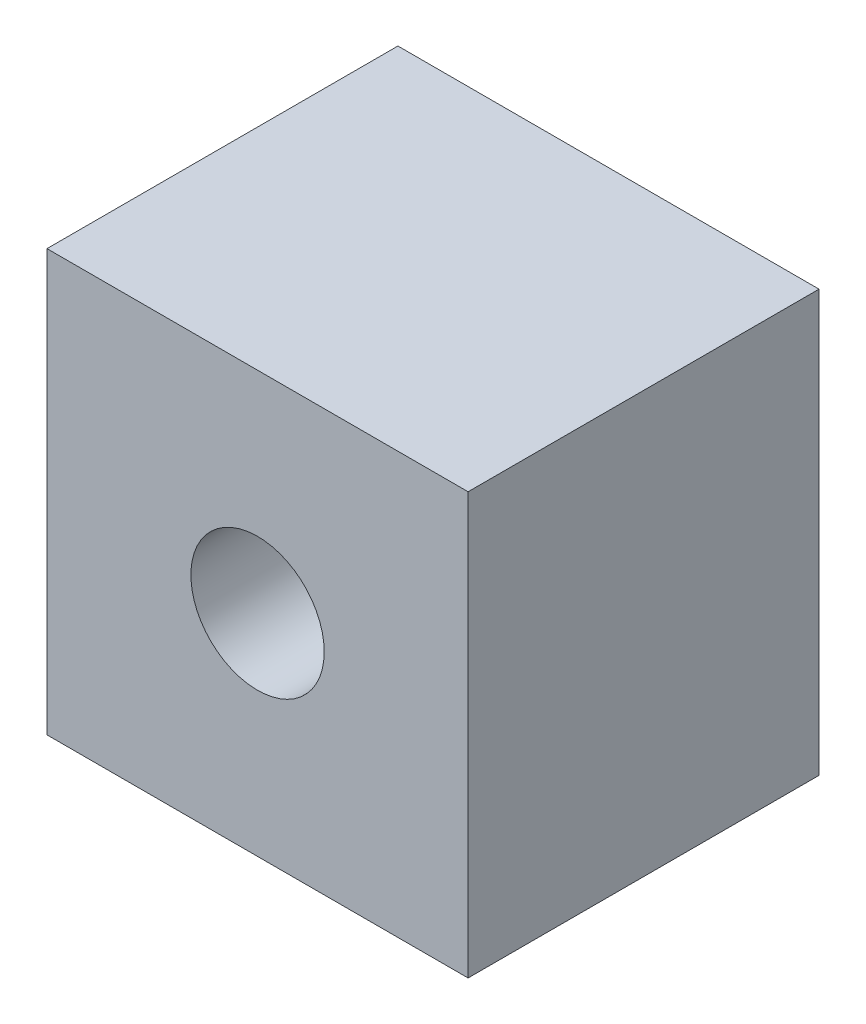
ISO-10303-21;
HEADER;
FILE_DESCRIPTION(('STEP AP214'),'2;1');
FILE_NAME('part.step','',(''),(''),'','','');
FILE_SCHEMA(('AUTOMOTIVE_DESIGN { 1 0 10303 214 1 1 1 1 }'));
ENDSEC;
DATA;
#1=APPLICATION_CONTEXT('core data for automotive mechanical design processes');
#2=APPLICATION_PROTOCOL_DEFINITION('international standard','automotive_design',2000,#1);
#3=PRODUCT_CONTEXT('',#1,'mechanical');
#4=PRODUCT('Part','Part','',(#3));
#5=PRODUCT_RELATED_PRODUCT_CATEGORY('part','',(#4));
#6=PRODUCT_DEFINITION_FORMATION('','',#4);
#7=PRODUCT_DEFINITION_CONTEXT('part definition',#1,'design');
#8=PRODUCT_DEFINITION('design','',#6,#7);
#9=PRODUCT_DEFINITION_SHAPE('','',#8);
#10=(LENGTH_UNIT() NAMED_UNIT(*) SI_UNIT(.MILLI.,.METRE.));
#11=(NAMED_UNIT(*) PLANE_ANGLE_UNIT() SI_UNIT($,.RADIAN.));
#12=(NAMED_UNIT(*) SI_UNIT($,.STERADIAN.) SOLID_ANGLE_UNIT());
#13=UNCERTAINTY_MEASURE_WITH_UNIT(LENGTH_MEASURE(1.E-05),#10,'distance_accuracy_value','');
#14=(GEOMETRIC_REPRESENTATION_CONTEXT(3) GLOBAL_UNCERTAINTY_ASSIGNED_CONTEXT((#13)) GLOBAL_UNIT_ASSIGNED_CONTEXT((#10,
#11,#12)) REPRESENTATION_CONTEXT('',''));
#15=CARTESIAN_POINT('',(0.,0.,0.));
#16=DIRECTION('',(0.,0.,1.));
#17=DIRECTION('',(1.,0.,0.));
#18=AXIS2_PLACEMENT_3D('',#15,#16,#17);
#19=CARTESIAN_POINT('',(0.,0.,10.));
#20=DIRECTION('',(0.,0.,1.));
#21=DIRECTION('',(1.,0.,0.));
#22=AXIS2_PLACEMENT_3D('',#19,#20,#21);
#23=PLANE('',#22);
#24=DIRECTION('',(0.,1.,0.));
#25=VECTOR('',#24,1.);
#26=CARTESIAN_POINT('',(6.,6.,10.));
#27=LINE('',#26,#25);
#28=CARTESIAN_POINT('',(6.,-6.,10.));
#29=VERTEX_POINT('',#28);
#30=CARTESIAN_POINT('',(6.,6.,10.));
#31=VERTEX_POINT('',#30);
#32=EDGE_CURVE('E92',#29,#31,#27,.T.);
#33=ORIENTED_EDGE('',*,*,#32,.T.);
#34=DIRECTION('',(-1.,0.,0.));
#35=VECTOR('',#34,1.);
#36=CARTESIAN_POINT('',(-6.,6.,10.));
#37=LINE('',#36,#35);
#38=CARTESIAN_POINT('',(-6.,6.,10.));
#39=VERTEX_POINT('',#38);
#40=EDGE_CURVE('E87',#31,#39,#37,.T.);
#41=ORIENTED_EDGE('',*,*,#40,.T.);
#42=DIRECTION('',(0.,-1.,0.));
#43=VECTOR('',#42,1.);
#44=CARTESIAN_POINT('',(-6.,6.,10.));
#45=LINE('',#44,#43);
#46=CARTESIAN_POINT('',(-6.,-6.,10.));
#47=VERTEX_POINT('',#46);
#48=EDGE_CURVE('E90',#39,#47,#45,.T.);
#49=ORIENTED_EDGE('',*,*,#48,.T.);
#50=DIRECTION('',(1.,0.,0.));
#51=VECTOR('',#50,1.);
#52=CARTESIAN_POINT('',(-6.,-6.,10.));
#53=LINE('',#52,#51);
#54=EDGE_CURVE('E57',#47,#29,#53,.T.);
#55=ORIENTED_EDGE('',*,*,#54,.T.);
#56=EDGE_LOOP('',(#33,#41,#49,#55));
#57=FACE_BOUND('',#56,.T.);
#58=CARTESIAN_POINT('',(0.,0.,10.));
#59=DIRECTION('',(0.,0.,1.));
#60=DIRECTION('',(1.,0.,0.));
#61=AXIS2_PLACEMENT_3D('',#58,#59,#60);
#62=CIRCLE('',#61,1.9);
#63=CARTESIAN_POINT('',(1.9,0.,10.));
#64=VERTEX_POINT('',#63);
#65=EDGE_CURVE('E112',#64,#64,#62,.T.);
#66=ORIENTED_EDGE('',*,*,#65,.F.);
#67=EDGE_LOOP('',(#66));
#68=FACE_BOUND('',#67,.T.);
#69=ADVANCED_FACE('F39',(#57,#68),#23,.T.);
#70=CARTESIAN_POINT('',(0.,0.,0.));
#71=DIRECTION('',(0.,0.,1.));
#72=DIRECTION('',(1.,0.,0.));
#73=AXIS2_PLACEMENT_3D('',#70,#71,#72);
#74=PLANE('',#73);
#75=DIRECTION('',(0.,1.,0.));
#76=VECTOR('',#75,1.);
#77=CARTESIAN_POINT('',(6.,6.,0.));
#78=LINE('',#77,#76);
#79=CARTESIAN_POINT('',(6.,-6.,0.));
#80=VERTEX_POINT('',#79);
#81=CARTESIAN_POINT('',(6.,6.,0.));
#82=VERTEX_POINT('',#81);
#83=EDGE_CURVE('E108',#80,#82,#78,.T.);
#84=ORIENTED_EDGE('',*,*,#83,.F.);
#85=DIRECTION('',(1.,0.,0.));
#86=VECTOR('',#85,1.);
#87=CARTESIAN_POINT('',(-6.,-6.,0.));
#88=LINE('',#87,#86);
#89=CARTESIAN_POINT('',(-6.,-6.,0.));
#90=VERTEX_POINT('',#89);
#91=EDGE_CURVE('E80',#90,#80,#88,.T.);
#92=ORIENTED_EDGE('',*,*,#91,.F.);
#93=DIRECTION('',(0.,-1.,0.));
#94=VECTOR('',#93,1.);
#95=CARTESIAN_POINT('',(-6.,6.,0.));
#96=LINE('',#95,#94);
#97=CARTESIAN_POINT('',(-6.,6.,0.));
#98=VERTEX_POINT('',#97);
#99=EDGE_CURVE('E74',#98,#90,#96,.T.);
#100=ORIENTED_EDGE('',*,*,#99,.F.);
#101=DIRECTION('',(-1.,0.,0.));
#102=VECTOR('',#101,1.);
#103=CARTESIAN_POINT('',(-6.,6.,0.));
#104=LINE('',#103,#102);
#105=EDGE_CURVE('E97',#82,#98,#104,.T.);
#106=ORIENTED_EDGE('',*,*,#105,.F.);
#107=EDGE_LOOP('',(#84,#92,#100,#106));
#108=FACE_BOUND('',#107,.T.);
#109=CARTESIAN_POINT('',(0.,0.,0.));
#110=DIRECTION('',(0.,0.,1.));
#111=DIRECTION('',(1.,0.,0.));
#112=AXIS2_PLACEMENT_3D('',#109,#110,#111);
#113=CIRCLE('',#112,1.9);
#114=CARTESIAN_POINT('',(1.9,0.,0.));
#115=VERTEX_POINT('',#114);
#116=EDGE_CURVE('E130',#115,#115,#113,.T.);
#117=ORIENTED_EDGE('',*,*,#116,.T.);
#118=EDGE_LOOP('',(#117));
#119=FACE_BOUND('',#118,.T.);
#120=ADVANCED_FACE('F125',(#108,#119),#74,.F.);
#121=CARTESIAN_POINT('',(6.,6.,10.));
#122=DIRECTION('',(-1.,0.,0.));
#123=DIRECTION('',(0.,-1.,0.));
#124=AXIS2_PLACEMENT_3D('',#121,#122,#123);
#125=PLANE('',#124);
#126=ORIENTED_EDGE('',*,*,#83,.T.);
#127=DIRECTION('',(0.,0.,-1.));
#128=VECTOR('',#127,1.);
#129=CARTESIAN_POINT('',(6.,6.,10.));
#130=LINE('',#129,#128);
#131=EDGE_CURVE('E11',#31,#82,#130,.T.);
#132=ORIENTED_EDGE('',*,*,#131,.F.);
#133=ORIENTED_EDGE('',*,*,#32,.F.);
#134=DIRECTION('',(0.,0.,-1.));
#135=VECTOR('',#134,1.);
#136=CARTESIAN_POINT('',(6.,-6.,10.));
#137=LINE('',#136,#135);
#138=EDGE_CURVE('E104',#29,#80,#137,.T.);
#139=ORIENTED_EDGE('',*,*,#138,.T.);
#140=EDGE_LOOP('',(#126,#132,#133,#139));
#141=FACE_BOUND('',#140,.T.);
#142=ADVANCED_FACE('F41',(#141),#125,.F.);
#143=CARTESIAN_POINT('',(-6.,6.,10.));
#144=DIRECTION('',(0.,-1.,0.));
#145=DIRECTION('',(0.,0.,-1.));
#146=AXIS2_PLACEMENT_3D('',#143,#144,#145);
#147=PLANE('',#146);
#148=ORIENTED_EDGE('',*,*,#105,.T.);
#149=DIRECTION('',(0.,0.,-1.));
#150=VECTOR('',#149,1.);
#151=CARTESIAN_POINT('',(-6.,6.,10.));
#152=LINE('',#151,#150);
#153=EDGE_CURVE('E49',#39,#98,#152,.T.);
#154=ORIENTED_EDGE('',*,*,#153,.F.);
#155=ORIENTED_EDGE('',*,*,#40,.F.);
#156=ORIENTED_EDGE('',*,*,#131,.T.);
#157=EDGE_LOOP('',(#148,#154,#155,#156));
#158=FACE_BOUND('',#157,.T.);
#159=ADVANCED_FACE('F96',(#158),#147,.F.);
#160=CARTESIAN_POINT('',(-6.,6.,10.));
#161=DIRECTION('',(1.,0.,0.));
#162=DIRECTION('',(0.,1.,0.));
#163=AXIS2_PLACEMENT_3D('',#160,#161,#162);
#164=PLANE('',#163);
#165=ORIENTED_EDGE('',*,*,#99,.T.);
#166=DIRECTION('',(0.,0.,-1.));
#167=VECTOR('',#166,1.);
#168=CARTESIAN_POINT('',(-6.,-6.,10.));
#169=LINE('',#168,#167);
#170=EDGE_CURVE('E99',#47,#90,#169,.T.);
#171=ORIENTED_EDGE('',*,*,#170,.F.);
#172=ORIENTED_EDGE('',*,*,#48,.F.);
#173=ORIENTED_EDGE('',*,*,#153,.T.);
#174=EDGE_LOOP('',(#165,#171,#172,#173));
#175=FACE_BOUND('',#174,.T.);
#176=ADVANCED_FACE('F100',(#175),#164,.F.);
#177=CARTESIAN_POINT('',(-6.,-6.,10.));
#178=DIRECTION('',(0.,1.,0.));
#179=DIRECTION('',(0.,0.,1.));
#180=AXIS2_PLACEMENT_3D('',#177,#178,#179);
#181=PLANE('',#180);
#182=ORIENTED_EDGE('',*,*,#91,.T.);
#183=ORIENTED_EDGE('',*,*,#138,.F.);
#184=ORIENTED_EDGE('',*,*,#54,.F.);
#185=ORIENTED_EDGE('',*,*,#170,.T.);
#186=EDGE_LOOP('',(#182,#183,#184,#185));
#187=FACE_BOUND('',#186,.T.);
#188=ADVANCED_FACE('F122',(#187),#181,.F.);
#189=CARTESIAN_POINT('',(0.,0.,10.));
#190=DIRECTION('',(0.,0.,-1.));
#191=DIRECTION('',(-1.,0.,0.));
#192=AXIS2_PLACEMENT_3D('',#189,#190,#191);
#193=CYLINDRICAL_SURFACE('',#192,1.9);
#194=ORIENTED_EDGE('',*,*,#65,.T.);
#195=EDGE_LOOP('',(#194));
#196=FACE_BOUND('',#195,.T.);
#197=ORIENTED_EDGE('',*,*,#116,.F.);
#198=EDGE_LOOP('',(#197));
#199=FACE_BOUND('',#198,.T.);
#200=ADVANCED_FACE('F138',(#196,#199),#193,.F.);
#201=CLOSED_SHELL('',(#69,#120,#142,#159,#176,#188,#200));
#202=MANIFOLD_SOLID_BREP('B2',#201);
#203=ADVANCED_BREP_SHAPE_REPRESENTATION('',(#18,#202),#14);
#204=SHAPE_DEFINITION_REPRESENTATION(#9,#203);
ENDSEC;
END-ISO-10303-21;
